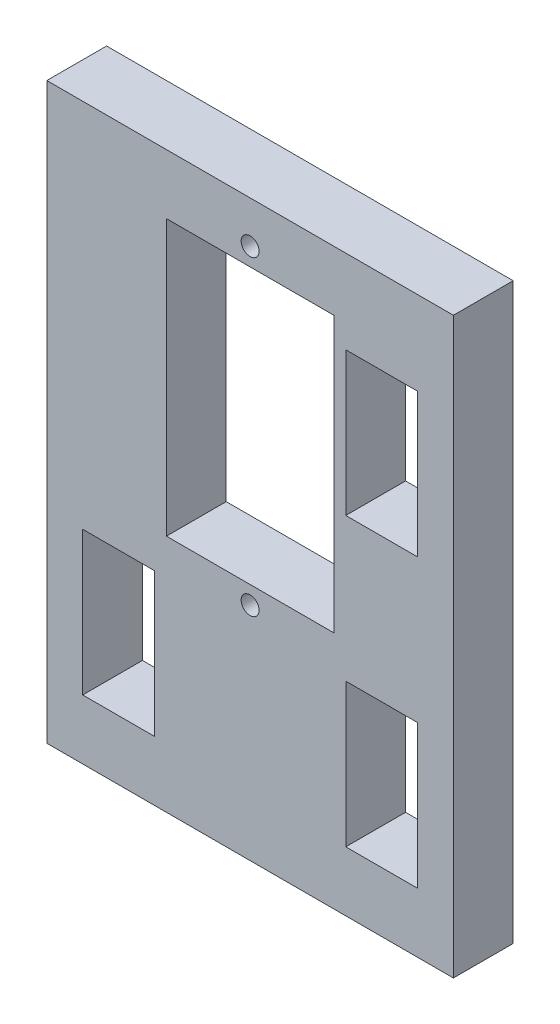
ISO-10303-21;
HEADER;
FILE_DESCRIPTION(('STEP AP214'),'2;1');
FILE_NAME('part.step','',(''),(''),'','','');
FILE_SCHEMA(('AUTOMOTIVE_DESIGN { 1 0 10303 214 1 1 1 1 }'));
ENDSEC;
DATA;
#1=APPLICATION_CONTEXT('core data for automotive mechanical design processes');
#2=APPLICATION_PROTOCOL_DEFINITION('international standard','automotive_design',2000,#1);
#3=PRODUCT_CONTEXT('',#1,'mechanical');
#4=PRODUCT('Part','Part','',(#3));
#5=PRODUCT_RELATED_PRODUCT_CATEGORY('part','',(#4));
#6=PRODUCT_DEFINITION_FORMATION('','',#4);
#7=PRODUCT_DEFINITION_CONTEXT('part definition',#1,'design');
#8=PRODUCT_DEFINITION('design','',#6,#7);
#9=PRODUCT_DEFINITION_SHAPE('','',#8);
#10=(LENGTH_UNIT() NAMED_UNIT(*) SI_UNIT(.MILLI.,.METRE.));
#11=(NAMED_UNIT(*) PLANE_ANGLE_UNIT() SI_UNIT($,.RADIAN.));
#12=(NAMED_UNIT(*) SI_UNIT($,.STERADIAN.) SOLID_ANGLE_UNIT());
#13=UNCERTAINTY_MEASURE_WITH_UNIT(LENGTH_MEASURE(1.E-05),#10,'distance_accuracy_value','');
#14=(GEOMETRIC_REPRESENTATION_CONTEXT(3) GLOBAL_UNCERTAINTY_ASSIGNED_CONTEXT((#13)) GLOBAL_UNIT_ASSIGNED_CONTEXT((#10,
#11,#12)) REPRESENTATION_CONTEXT('',''));
#15=CARTESIAN_POINT('',(0.,0.,0.));
#16=DIRECTION('',(0.,0.,1.));
#17=DIRECTION('',(1.,0.,0.));
#18=AXIS2_PLACEMENT_3D('',#15,#16,#17);
#19=CARTESIAN_POINT('',(0.,0.,5.));
#20=DIRECTION('',(0.,0.,-1.));
#21=DIRECTION('',(-1.,0.,0.));
#22=AXIS2_PLACEMENT_3D('',#19,#20,#21);
#23=PLANE('',#22);
#24=DIRECTION('',(0.,1.,0.));
#25=VECTOR('',#24,1.);
#26=CARTESIAN_POINT('',(31.,29.,5.));
#27=LINE('',#26,#25);
#28=CARTESIAN_POINT('',(31.,29.,5.));
#29=VERTEX_POINT('',#28);
#30=CARTESIAN_POINT('',(31.,41.,5.));
#31=VERTEX_POINT('',#30);
#32=EDGE_CURVE('E206',#29,#31,#27,.T.);
#33=ORIENTED_EDGE('',*,*,#32,.F.);
#34=DIRECTION('',(1.,0.,0.));
#35=VECTOR('',#34,1.);
#36=CARTESIAN_POINT('',(31.,29.,5.));
#37=LINE('',#36,#35);
#38=CARTESIAN_POINT('',(25.,29.,5.));
#39=VERTEX_POINT('',#38);
#40=EDGE_CURVE('E214',#39,#29,#37,.T.);
#41=ORIENTED_EDGE('',*,*,#40,.F.);
#42=DIRECTION('',(0.,-1.,0.));
#43=VECTOR('',#42,1.);
#44=CARTESIAN_POINT('',(25.,29.,5.));
#45=LINE('',#44,#43);
#46=CARTESIAN_POINT('',(25.,41.,5.));
#47=VERTEX_POINT('',#46);
#48=EDGE_CURVE('E211',#47,#39,#45,.T.);
#49=ORIENTED_EDGE('',*,*,#48,.F.);
#50=DIRECTION('',(-1.,0.,0.));
#51=VECTOR('',#50,1.);
#52=CARTESIAN_POINT('',(31.,41.,5.));
#53=LINE('',#52,#51);
#54=EDGE_CURVE('E208',#31,#47,#53,.T.);
#55=ORIENTED_EDGE('',*,*,#54,.F.);
#56=EDGE_LOOP('',(#33,#41,#49,#55));
#57=FACE_BOUND('',#56,.T.);
#58=CARTESIAN_POINT('',(17.,44.5,5.));
#59=DIRECTION('',(0.,0.,1.));
#60=DIRECTION('',(1.,0.,0.));
#61=AXIS2_PLACEMENT_3D('',#58,#59,#60);
#62=CIRCLE('',#61,0.750000000000002);
#63=CARTESIAN_POINT('',(17.75,44.5,5.));
#64=VERTEX_POINT('',#63);
#65=EDGE_CURVE('E268',#64,#64,#62,.T.);
#66=ORIENTED_EDGE('',*,*,#65,.F.);
#67=EDGE_LOOP('',(#66));
#68=FACE_BOUND('',#67,.T.);
#69=CARTESIAN_POINT('',(17.,18.5,5.));
#70=DIRECTION('',(0.,0.,1.));
#71=DIRECTION('',(1.,0.,0.));
#72=AXIS2_PLACEMENT_3D('',#69,#70,#71);
#73=CIRCLE('',#72,0.750000000000002);
#74=CARTESIAN_POINT('',(17.75,18.5,5.));
#75=VERTEX_POINT('',#74);
#76=EDGE_CURVE('E274',#75,#75,#73,.T.);
#77=ORIENTED_EDGE('',*,*,#76,.F.);
#78=EDGE_LOOP('',(#77));
#79=FACE_BOUND('',#78,.T.);
#80=DIRECTION('',(0.,-1.,0.));
#81=VECTOR('',#80,1.);
#82=CARTESIAN_POINT('',(10.,20.,5.));
#83=LINE('',#82,#81);
#84=CARTESIAN_POINT('',(10.,43.,5.));
#85=VERTEX_POINT('',#84);
#86=CARTESIAN_POINT('',(10.,20.,5.));
#87=VERTEX_POINT('',#86);
#88=EDGE_CURVE('E280',#85,#87,#83,.T.);
#89=ORIENTED_EDGE('',*,*,#88,.F.);
#90=DIRECTION('',(-1.,0.,0.));
#91=VECTOR('',#90,1.);
#92=CARTESIAN_POINT('',(24.,43.,5.));
#93=LINE('',#92,#91);
#94=CARTESIAN_POINT('',(24.,43.,5.));
#95=VERTEX_POINT('',#94);
#96=EDGE_CURVE('E288',#95,#85,#93,.T.);
#97=ORIENTED_EDGE('',*,*,#96,.F.);
#98=DIRECTION('',(0.,1.,0.));
#99=VECTOR('',#98,1.);
#100=CARTESIAN_POINT('',(24.,20.,5.));
#101=LINE('',#100,#99);
#102=CARTESIAN_POINT('',(24.,20.,5.));
#103=VERTEX_POINT('',#102);
#104=EDGE_CURVE('E285',#103,#95,#101,.T.);
#105=ORIENTED_EDGE('',*,*,#104,.F.);
#106=DIRECTION('',(1.,0.,0.));
#107=VECTOR('',#106,1.);
#108=CARTESIAN_POINT('',(24.,20.,5.));
#109=LINE('',#108,#107);
#110=EDGE_CURVE('E282',#87,#103,#109,.T.);
#111=ORIENTED_EDGE('',*,*,#110,.F.);
#112=EDGE_LOOP('',(#89,#97,#105,#111));
#113=FACE_BOUND('',#112,.T.);
#114=DIRECTION('',(0.,-1.,0.));
#115=VECTOR('',#114,1.);
#116=CARTESIAN_POINT('',(0.,0.,5.));
#117=LINE('',#116,#115);
#118=CARTESIAN_POINT('',(0.,48.,5.));
#119=VERTEX_POINT('',#118);
#120=CARTESIAN_POINT('',(0.,0.,5.));
#121=VERTEX_POINT('',#120);
#122=EDGE_CURVE('E311',#119,#121,#117,.T.);
#123=ORIENTED_EDGE('',*,*,#122,.T.);
#124=DIRECTION('',(1.,0.,0.));
#125=VECTOR('',#124,1.);
#126=CARTESIAN_POINT('',(0.,0.,5.));
#127=LINE('',#126,#125);
#128=CARTESIAN_POINT('',(34.,0.,5.));
#129=VERTEX_POINT('',#128);
#130=EDGE_CURVE('E314',#121,#129,#127,.T.);
#131=ORIENTED_EDGE('',*,*,#130,.T.);
#132=DIRECTION('',(0.,1.,0.));
#133=VECTOR('',#132,1.);
#134=CARTESIAN_POINT('',(34.,0.,5.));
#135=LINE('',#134,#133);
#136=CARTESIAN_POINT('',(33.9999999999999,48.,5.));
#137=VERTEX_POINT('',#136);
#138=EDGE_CURVE('E317',#129,#137,#135,.T.);
#139=ORIENTED_EDGE('',*,*,#138,.T.);
#140=DIRECTION('',(-1.,0.,0.));
#141=VECTOR('',#140,1.);
#142=CARTESIAN_POINT('',(0.,48.,5.));
#143=LINE('',#142,#141);
#144=EDGE_CURVE('E319',#137,#119,#143,.T.);
#145=ORIENTED_EDGE('',*,*,#144,.T.);
#146=EDGE_LOOP('',(#123,#131,#139,#145));
#147=FACE_BOUND('',#146,.T.);
#148=DIRECTION('',(0.,1.,0.));
#149=VECTOR('',#148,1.);
#150=CARTESIAN_POINT('',(31.,5.,5.));
#151=LINE('',#150,#149);
#152=CARTESIAN_POINT('',(31.,5.,5.));
#153=VERTEX_POINT('',#152);
#154=CARTESIAN_POINT('',(31.,17.,5.));
#155=VERTEX_POINT('',#154);
#156=EDGE_CURVE('E237',#153,#155,#151,.T.);
#157=ORIENTED_EDGE('',*,*,#156,.F.);
#158=DIRECTION('',(1.,0.,0.));
#159=VECTOR('',#158,1.);
#160=CARTESIAN_POINT('',(31.,5.,5.));
#161=LINE('',#160,#159);
#162=CARTESIAN_POINT('',(25.,5.,5.));
#163=VERTEX_POINT('',#162);
#164=EDGE_CURVE('E245',#163,#153,#161,.T.);
#165=ORIENTED_EDGE('',*,*,#164,.F.);
#166=DIRECTION('',(0.,-1.,0.));
#167=VECTOR('',#166,1.);
#168=CARTESIAN_POINT('',(25.,5.,5.));
#169=LINE('',#168,#167);
#170=CARTESIAN_POINT('',(25.,17.,5.));
#171=VERTEX_POINT('',#170);
#172=EDGE_CURVE('E242',#171,#163,#169,.T.);
#173=ORIENTED_EDGE('',*,*,#172,.F.);
#174=DIRECTION('',(-1.,0.,0.));
#175=VECTOR('',#174,1.);
#176=CARTESIAN_POINT('',(31.,17.,5.));
#177=LINE('',#176,#175);
#178=EDGE_CURVE('E239',#155,#171,#177,.T.);
#179=ORIENTED_EDGE('',*,*,#178,.F.);
#180=EDGE_LOOP('',(#157,#165,#173,#179));
#181=FACE_BOUND('',#180,.T.);
#182=DIRECTION('',(0.,1.,0.));
#183=VECTOR('',#182,1.);
#184=CARTESIAN_POINT('',(9.00000000000001,5.,5.));
#185=LINE('',#184,#183);
#186=CARTESIAN_POINT('',(9.00000000000001,5.,5.));
#187=VERTEX_POINT('',#186);
#188=CARTESIAN_POINT('',(8.99999999999993,17.,5.));
#189=VERTEX_POINT('',#188);
#190=EDGE_CURVE('E170',#187,#189,#185,.T.);
#191=ORIENTED_EDGE('',*,*,#190,.F.);
#192=DIRECTION('',(1.,0.,0.));
#193=VECTOR('',#192,1.);
#194=CARTESIAN_POINT('',(9.00000000000001,5.,5.));
#195=LINE('',#194,#193);
#196=CARTESIAN_POINT('',(3.00000000000001,5.,5.));
#197=VERTEX_POINT('',#196);
#198=EDGE_CURVE('E192',#197,#187,#195,.T.);
#199=ORIENTED_EDGE('',*,*,#198,.F.);
#200=DIRECTION('',(0.,-1.,0.));
#201=VECTOR('',#200,1.);
#202=CARTESIAN_POINT('',(3.00000000000001,5.,5.));
#203=LINE('',#202,#201);
#204=CARTESIAN_POINT('',(2.99999999999994,17.,5.));
#205=VERTEX_POINT('',#204);
#206=EDGE_CURVE('E190',#205,#197,#203,.T.);
#207=ORIENTED_EDGE('',*,*,#206,.F.);
#208=DIRECTION('',(-1.,0.,0.));
#209=VECTOR('',#208,1.);
#210=CARTESIAN_POINT('',(8.99999999999993,17.,5.));
#211=LINE('',#210,#209);
#212=EDGE_CURVE('E178',#189,#205,#211,.T.);
#213=ORIENTED_EDGE('',*,*,#212,.F.);
#214=EDGE_LOOP('',(#191,#199,#207,#213));
#215=FACE_BOUND('',#214,.T.);
#216=ADVANCED_FACE('F33',(#57,#68,#79,#113,#147,#181,#215),#23,.F.);
#217=CARTESIAN_POINT('',(0.,0.,0.));
#218=DIRECTION('',(0.,0.,-1.));
#219=DIRECTION('',(-1.,0.,0.));
#220=AXIS2_PLACEMENT_3D('',#217,#218,#219);
#221=PLANE('',#220);
#222=CARTESIAN_POINT('',(17.,18.5,0.));
#223=DIRECTION('',(0.,0.,1.));
#224=DIRECTION('',(1.,0.,0.));
#225=AXIS2_PLACEMENT_3D('',#222,#223,#224);
#226=CIRCLE('',#225,0.750000000000002);
#227=CARTESIAN_POINT('',(17.75,18.5,0.));
#228=VERTEX_POINT('',#227);
#229=EDGE_CURVE('E271',#228,#228,#226,.T.);
#230=ORIENTED_EDGE('',*,*,#229,.T.);
#231=EDGE_LOOP('',(#230));
#232=FACE_BOUND('',#231,.T.);
#233=DIRECTION('',(0.,-1.,0.));
#234=VECTOR('',#233,1.);
#235=CARTESIAN_POINT('',(0.,0.,0.));
#236=LINE('',#235,#234);
#237=CARTESIAN_POINT('',(0.,48.,0.));
#238=VERTEX_POINT('',#237);
#239=CARTESIAN_POINT('',(0.,0.,0.));
#240=VERTEX_POINT('',#239);
#241=EDGE_CURVE('E310',#238,#240,#236,.T.);
#242=ORIENTED_EDGE('',*,*,#241,.F.);
#243=DIRECTION('',(-1.,0.,0.));
#244=VECTOR('',#243,1.);
#245=CARTESIAN_POINT('',(0.,48.,0.));
#246=LINE('',#245,#244);
#247=CARTESIAN_POINT('',(33.9999999999999,48.,0.));
#248=VERTEX_POINT('',#247);
#249=EDGE_CURVE('E315',#248,#238,#246,.T.);
#250=ORIENTED_EDGE('',*,*,#249,.F.);
#251=DIRECTION('',(0.,1.,0.));
#252=VECTOR('',#251,1.);
#253=CARTESIAN_POINT('',(34.,0.,0.));
#254=LINE('',#253,#252);
#255=CARTESIAN_POINT('',(34.,0.,0.));
#256=VERTEX_POINT('',#255);
#257=EDGE_CURVE('E326',#256,#248,#254,.T.);
#258=ORIENTED_EDGE('',*,*,#257,.F.);
#259=DIRECTION('',(1.,0.,0.));
#260=VECTOR('',#259,1.);
#261=CARTESIAN_POINT('',(0.,0.,0.));
#262=LINE('',#261,#260);
#263=EDGE_CURVE('E324',#240,#256,#262,.T.);
#264=ORIENTED_EDGE('',*,*,#263,.F.);
#265=EDGE_LOOP('',(#242,#250,#258,#264));
#266=FACE_BOUND('',#265,.T.);
#267=DIRECTION('',(-1.,0.,0.));
#268=VECTOR('',#267,1.);
#269=CARTESIAN_POINT('',(24.,43.,0.));
#270=LINE('',#269,#268);
#271=CARTESIAN_POINT('',(24.,43.,0.));
#272=VERTEX_POINT('',#271);
#273=CARTESIAN_POINT('',(10.,43.,0.));
#274=VERTEX_POINT('',#273);
#275=EDGE_CURVE('E283',#272,#274,#270,.T.);
#276=ORIENTED_EDGE('',*,*,#275,.T.);
#277=DIRECTION('',(0.,-1.,0.));
#278=VECTOR('',#277,1.);
#279=CARTESIAN_POINT('',(10.,20.,0.));
#280=LINE('',#279,#278);
#281=CARTESIAN_POINT('',(10.,20.,0.));
#282=VERTEX_POINT('',#281);
#283=EDGE_CURVE('E277',#274,#282,#280,.T.);
#284=ORIENTED_EDGE('',*,*,#283,.T.);
#285=DIRECTION('',(1.,0.,0.));
#286=VECTOR('',#285,1.);
#287=CARTESIAN_POINT('',(24.,20.,0.));
#288=LINE('',#287,#286);
#289=CARTESIAN_POINT('',(24.,20.,0.));
#290=VERTEX_POINT('',#289);
#291=EDGE_CURVE('E293',#282,#290,#288,.T.);
#292=ORIENTED_EDGE('',*,*,#291,.T.);
#293=DIRECTION('',(0.,1.,0.));
#294=VECTOR('',#293,1.);
#295=CARTESIAN_POINT('',(24.,20.,0.));
#296=LINE('',#295,#294);
#297=EDGE_CURVE('E296',#290,#272,#296,.T.);
#298=ORIENTED_EDGE('',*,*,#297,.T.);
#299=EDGE_LOOP('',(#276,#284,#292,#298));
#300=FACE_BOUND('',#299,.T.);
#301=CARTESIAN_POINT('',(17.,44.5,0.));
#302=DIRECTION('',(0.,0.,1.));
#303=DIRECTION('',(1.,0.,0.));
#304=AXIS2_PLACEMENT_3D('',#301,#302,#303);
#305=CIRCLE('',#304,0.750000000000002);
#306=CARTESIAN_POINT('',(17.75,44.5,0.));
#307=VERTEX_POINT('',#306);
#308=EDGE_CURVE('E267',#307,#307,#305,.T.);
#309=ORIENTED_EDGE('',*,*,#308,.T.);
#310=EDGE_LOOP('',(#309));
#311=FACE_BOUND('',#310,.T.);
#312=DIRECTION('',(1.,0.,0.));
#313=VECTOR('',#312,1.);
#314=CARTESIAN_POINT('',(31.,5.,0.));
#315=LINE('',#314,#313);
#316=CARTESIAN_POINT('',(25.,5.,0.));
#317=VERTEX_POINT('',#316);
#318=CARTESIAN_POINT('',(31.,5.,0.));
#319=VERTEX_POINT('',#318);
#320=EDGE_CURVE('E240',#317,#319,#315,.T.);
#321=ORIENTED_EDGE('',*,*,#320,.T.);
#322=DIRECTION('',(0.,1.,0.));
#323=VECTOR('',#322,1.);
#324=CARTESIAN_POINT('',(31.,5.,0.));
#325=LINE('',#324,#323);
#326=CARTESIAN_POINT('',(31.,17.,0.));
#327=VERTEX_POINT('',#326);
#328=EDGE_CURVE('E236',#319,#327,#325,.T.);
#329=ORIENTED_EDGE('',*,*,#328,.T.);
#330=DIRECTION('',(-1.,0.,0.));
#331=VECTOR('',#330,1.);
#332=CARTESIAN_POINT('',(31.,17.,0.));
#333=LINE('',#332,#331);
#334=CARTESIAN_POINT('',(25.,17.,0.));
#335=VERTEX_POINT('',#334);
#336=EDGE_CURVE('E250',#327,#335,#333,.T.);
#337=ORIENTED_EDGE('',*,*,#336,.T.);
#338=DIRECTION('',(0.,-1.,0.));
#339=VECTOR('',#338,1.);
#340=CARTESIAN_POINT('',(25.,5.,0.));
#341=LINE('',#340,#339);
#342=EDGE_CURVE('E253',#335,#317,#341,.T.);
#343=ORIENTED_EDGE('',*,*,#342,.T.);
#344=EDGE_LOOP('',(#321,#329,#337,#343));
#345=FACE_BOUND('',#344,.T.);
#346=DIRECTION('',(1.,0.,0.));
#347=VECTOR('',#346,1.);
#348=CARTESIAN_POINT('',(31.,29.,0.));
#349=LINE('',#348,#347);
#350=CARTESIAN_POINT('',(25.,29.,0.));
#351=VERTEX_POINT('',#350);
#352=CARTESIAN_POINT('',(31.,29.,0.));
#353=VERTEX_POINT('',#352);
#354=EDGE_CURVE('E209',#351,#353,#349,.T.);
#355=ORIENTED_EDGE('',*,*,#354,.T.);
#356=DIRECTION('',(0.,1.,0.));
#357=VECTOR('',#356,1.);
#358=CARTESIAN_POINT('',(31.,29.,0.));
#359=LINE('',#358,#357);
#360=CARTESIAN_POINT('',(31.,41.,0.));
#361=VERTEX_POINT('',#360);
#362=EDGE_CURVE('E186',#353,#361,#359,.T.);
#363=ORIENTED_EDGE('',*,*,#362,.T.);
#364=DIRECTION('',(-1.,0.,0.));
#365=VECTOR('',#364,1.);
#366=CARTESIAN_POINT('',(31.,41.,0.));
#367=LINE('',#366,#365);
#368=CARTESIAN_POINT('',(25.,41.,0.));
#369=VERTEX_POINT('',#368);
#370=EDGE_CURVE('E219',#361,#369,#367,.T.);
#371=ORIENTED_EDGE('',*,*,#370,.T.);
#372=DIRECTION('',(0.,-1.,0.));
#373=VECTOR('',#372,1.);
#374=CARTESIAN_POINT('',(25.,29.,0.));
#375=LINE('',#374,#373);
#376=EDGE_CURVE('E222',#369,#351,#375,.T.);
#377=ORIENTED_EDGE('',*,*,#376,.T.);
#378=EDGE_LOOP('',(#355,#363,#371,#377));
#379=FACE_BOUND('',#378,.T.);
#380=DIRECTION('',(1.,0.,0.));
#381=VECTOR('',#380,1.);
#382=CARTESIAN_POINT('',(9.00000000000001,5.,0.));
#383=LINE('',#382,#381);
#384=CARTESIAN_POINT('',(3.00000000000001,5.,0.));
#385=VERTEX_POINT('',#384);
#386=CARTESIAN_POINT('',(9.00000000000001,5.,0.));
#387=VERTEX_POINT('',#386);
#388=EDGE_CURVE('E179',#385,#387,#383,.T.);
#389=ORIENTED_EDGE('',*,*,#388,.T.);
#390=DIRECTION('',(0.,1.,0.));
#391=VECTOR('',#390,1.);
#392=CARTESIAN_POINT('',(9.00000000000001,5.,0.));
#393=LINE('',#392,#391);
#394=CARTESIAN_POINT('',(8.99999999999993,17.,0.));
#395=VERTEX_POINT('',#394);
#396=EDGE_CURVE('E56',#387,#395,#393,.T.);
#397=ORIENTED_EDGE('',*,*,#396,.T.);
#398=DIRECTION('',(-1.,0.,0.));
#399=VECTOR('',#398,1.);
#400=CARTESIAN_POINT('',(8.99999999999993,17.,0.));
#401=LINE('',#400,#399);
#402=CARTESIAN_POINT('',(2.99999999999994,17.,0.));
#403=VERTEX_POINT('',#402);
#404=EDGE_CURVE('E185',#395,#403,#401,.T.);
#405=ORIENTED_EDGE('',*,*,#404,.T.);
#406=DIRECTION('',(0.,-1.,0.));
#407=VECTOR('',#406,1.);
#408=CARTESIAN_POINT('',(3.00000000000001,5.,0.));
#409=LINE('',#408,#407);
#410=EDGE_CURVE('E198',#403,#385,#409,.T.);
#411=ORIENTED_EDGE('',*,*,#410,.T.);
#412=EDGE_LOOP('',(#389,#397,#405,#411));
#413=FACE_BOUND('',#412,.T.);
#414=ADVANCED_FACE('F344',(#232,#266,#300,#311,#345,#379,#413),#221,.T.);
#415=CARTESIAN_POINT('',(0.,0.,5.));
#416=DIRECTION('',(1.,0.,0.));
#417=DIRECTION('',(0.,0.,-1.));
#418=AXIS2_PLACEMENT_3D('',#415,#416,#417);
#419=PLANE('',#418);
#420=ORIENTED_EDGE('',*,*,#241,.T.);
#421=DIRECTION('',(0.,0.,-1.));
#422=VECTOR('',#421,1.);
#423=CARTESIAN_POINT('',(0.,0.,5.));
#424=LINE('',#423,#422);
#425=EDGE_CURVE('E11',#121,#240,#424,.T.);
#426=ORIENTED_EDGE('',*,*,#425,.F.);
#427=ORIENTED_EDGE('',*,*,#122,.F.);
#428=DIRECTION('',(0.,0.,-1.));
#429=VECTOR('',#428,1.);
#430=CARTESIAN_POINT('',(0.,48.,5.));
#431=LINE('',#430,#429);
#432=EDGE_CURVE('E321',#119,#238,#431,.T.);
#433=ORIENTED_EDGE('',*,*,#432,.T.);
#434=EDGE_LOOP('',(#420,#426,#427,#433));
#435=FACE_BOUND('',#434,.T.);
#436=ADVANCED_FACE('F35',(#435),#419,.F.);
#437=CARTESIAN_POINT('',(0.,0.,5.));
#438=DIRECTION('',(0.,1.,0.));
#439=DIRECTION('',(0.,0.,1.));
#440=AXIS2_PLACEMENT_3D('',#437,#438,#439);
#441=PLANE('',#440);
#442=ORIENTED_EDGE('',*,*,#263,.T.);
#443=DIRECTION('',(0.,0.,-1.));
#444=VECTOR('',#443,1.);
#445=CARTESIAN_POINT('',(34.,0.,5.));
#446=LINE('',#445,#444);
#447=EDGE_CURVE('E41',#129,#256,#446,.T.);
#448=ORIENTED_EDGE('',*,*,#447,.F.);
#449=ORIENTED_EDGE('',*,*,#130,.F.);
#450=ORIENTED_EDGE('',*,*,#425,.T.);
#451=EDGE_LOOP('',(#442,#448,#449,#450));
#452=FACE_BOUND('',#451,.T.);
#453=ADVANCED_FACE('F355',(#452),#441,.F.);
#454=CARTESIAN_POINT('',(34.,0.,5.));
#455=DIRECTION('',(-1.,0.,0.));
#456=DIRECTION('',(0.,-1.,0.));
#457=AXIS2_PLACEMENT_3D('',#454,#455,#456);
#458=PLANE('',#457);
#459=ORIENTED_EDGE('',*,*,#257,.T.);
#460=DIRECTION('',(0.,0.,-1.));
#461=VECTOR('',#460,1.);
#462=CARTESIAN_POINT('',(33.9999999999999,48.,5.));
#463=LINE('',#462,#461);
#464=EDGE_CURVE('E331',#137,#248,#463,.T.);
#465=ORIENTED_EDGE('',*,*,#464,.F.);
#466=ORIENTED_EDGE('',*,*,#138,.F.);
#467=ORIENTED_EDGE('',*,*,#447,.T.);
#468=EDGE_LOOP('',(#459,#465,#466,#467));
#469=FACE_BOUND('',#468,.T.);
#470=ADVANCED_FACE('F338',(#469),#458,.F.);
#471=CARTESIAN_POINT('',(0.,48.,5.));
#472=DIRECTION('',(0.,-1.,0.));
#473=DIRECTION('',(1.,0.,0.));
#474=AXIS2_PLACEMENT_3D('',#471,#472,#473);
#475=PLANE('',#474);
#476=ORIENTED_EDGE('',*,*,#249,.T.);
#477=ORIENTED_EDGE('',*,*,#432,.F.);
#478=ORIENTED_EDGE('',*,*,#144,.F.);
#479=ORIENTED_EDGE('',*,*,#464,.T.);
#480=EDGE_LOOP('',(#476,#477,#478,#479));
#481=FACE_BOUND('',#480,.T.);
#482=ADVANCED_FACE('F348',(#481),#475,.F.);
#483=CARTESIAN_POINT('',(10.,20.,5.));
#484=DIRECTION('',(1.,0.,0.));
#485=DIRECTION('',(0.,1.,0.));
#486=AXIS2_PLACEMENT_3D('',#483,#484,#485);
#487=PLANE('',#486);
#488=ORIENTED_EDGE('',*,*,#283,.F.);
#489=DIRECTION('',(0.,0.,-1.));
#490=VECTOR('',#489,1.);
#491=CARTESIAN_POINT('',(10.,43.,5.));
#492=LINE('',#491,#490);
#493=EDGE_CURVE('E290',#85,#274,#492,.T.);
#494=ORIENTED_EDGE('',*,*,#493,.F.);
#495=ORIENTED_EDGE('',*,*,#88,.T.);
#496=DIRECTION('',(0.,0.,-1.));
#497=VECTOR('',#496,1.);
#498=CARTESIAN_POINT('',(10.,20.,5.));
#499=LINE('',#498,#497);
#500=EDGE_CURVE('E307',#87,#282,#499,.T.);
#501=ORIENTED_EDGE('',*,*,#500,.T.);
#502=EDGE_LOOP('',(#488,#494,#495,#501));
#503=FACE_BOUND('',#502,.T.);
#504=ADVANCED_FACE('F373',(#503),#487,.T.);
#505=CARTESIAN_POINT('',(24.,20.,5.));
#506=DIRECTION('',(0.,1.,0.));
#507=DIRECTION('',(0.,0.,1.));
#508=AXIS2_PLACEMENT_3D('',#505,#506,#507);
#509=PLANE('',#508);
#510=ORIENTED_EDGE('',*,*,#291,.F.);
#511=ORIENTED_EDGE('',*,*,#500,.F.);
#512=ORIENTED_EDGE('',*,*,#110,.T.);
#513=DIRECTION('',(0.,0.,-1.));
#514=VECTOR('',#513,1.);
#515=CARTESIAN_POINT('',(24.,20.,5.));
#516=LINE('',#515,#514);
#517=EDGE_CURVE('E305',#103,#290,#516,.T.);
#518=ORIENTED_EDGE('',*,*,#517,.T.);
#519=EDGE_LOOP('',(#510,#511,#512,#518));
#520=FACE_BOUND('',#519,.T.);
#521=ADVANCED_FACE('F380',(#520),#509,.T.);
#522=CARTESIAN_POINT('',(24.,20.,5.));
#523=DIRECTION('',(-1.,0.,0.));
#524=DIRECTION('',(0.,-1.,0.));
#525=AXIS2_PLACEMENT_3D('',#522,#523,#524);
#526=PLANE('',#525);
#527=ORIENTED_EDGE('',*,*,#297,.F.);
#528=ORIENTED_EDGE('',*,*,#517,.F.);
#529=ORIENTED_EDGE('',*,*,#104,.T.);
#530=DIRECTION('',(0.,0.,-1.));
#531=VECTOR('',#530,1.);
#532=CARTESIAN_POINT('',(24.,43.,5.));
#533=LINE('',#532,#531);
#534=EDGE_CURVE('E303',#95,#272,#533,.T.);
#535=ORIENTED_EDGE('',*,*,#534,.T.);
#536=EDGE_LOOP('',(#527,#528,#529,#535));
#537=FACE_BOUND('',#536,.T.);
#538=ADVANCED_FACE('F385',(#537),#526,.T.);
#539=CARTESIAN_POINT('',(24.,43.,5.));
#540=DIRECTION('',(0.,-1.,0.));
#541=DIRECTION('',(0.,0.,-1.));
#542=AXIS2_PLACEMENT_3D('',#539,#540,#541);
#543=PLANE('',#542);
#544=ORIENTED_EDGE('',*,*,#275,.F.);
#545=ORIENTED_EDGE('',*,*,#534,.F.);
#546=ORIENTED_EDGE('',*,*,#96,.T.);
#547=ORIENTED_EDGE('',*,*,#493,.T.);
#548=EDGE_LOOP('',(#544,#545,#546,#547));
#549=FACE_BOUND('',#548,.T.);
#550=ADVANCED_FACE('F392',(#549),#543,.T.);
#551=CARTESIAN_POINT('',(17.,18.5,5.));
#552=DIRECTION('',(0.,0.,-1.));
#553=DIRECTION('',(-1.,0.,0.));
#554=AXIS2_PLACEMENT_3D('',#551,#552,#553);
#555=CYLINDRICAL_SURFACE('',#554,0.750000000000002);
#556=ORIENTED_EDGE('',*,*,#76,.T.);
#557=EDGE_LOOP('',(#556));
#558=FACE_BOUND('',#557,.T.);
#559=ORIENTED_EDGE('',*,*,#229,.F.);
#560=EDGE_LOOP('',(#559));
#561=FACE_BOUND('',#560,.T.);
#562=ADVANCED_FACE('F406',(#558,#561),#555,.F.);
#563=CARTESIAN_POINT('',(17.,44.5,5.));
#564=DIRECTION('',(0.,0.,-1.));
#565=DIRECTION('',(-1.,0.,0.));
#566=AXIS2_PLACEMENT_3D('',#563,#564,#565);
#567=CYLINDRICAL_SURFACE('',#566,0.750000000000002);
#568=ORIENTED_EDGE('',*,*,#65,.T.);
#569=EDGE_LOOP('',(#568));
#570=FACE_BOUND('',#569,.T.);
#571=ORIENTED_EDGE('',*,*,#308,.F.);
#572=EDGE_LOOP('',(#571));
#573=FACE_BOUND('',#572,.T.);
#574=ADVANCED_FACE('F411',(#570,#573),#567,.F.);
#575=CARTESIAN_POINT('',(31.,5.,5.));
#576=DIRECTION('',(-1.,0.,0.));
#577=DIRECTION('',(0.,0.,1.));
#578=AXIS2_PLACEMENT_3D('',#575,#576,#577);
#579=PLANE('',#578);
#580=ORIENTED_EDGE('',*,*,#328,.F.);
#581=DIRECTION('',(0.,0.,-1.));
#582=VECTOR('',#581,1.);
#583=CARTESIAN_POINT('',(31.,5.,5.));
#584=LINE('',#583,#582);
#585=EDGE_CURVE('E247',#153,#319,#584,.T.);
#586=ORIENTED_EDGE('',*,*,#585,.F.);
#587=ORIENTED_EDGE('',*,*,#156,.T.);
#588=DIRECTION('',(0.,0.,-1.));
#589=VECTOR('',#588,1.);
#590=CARTESIAN_POINT('',(31.,17.,5.));
#591=LINE('',#590,#589);
#592=EDGE_CURVE('E264',#155,#327,#591,.T.);
#593=ORIENTED_EDGE('',*,*,#592,.T.);
#594=EDGE_LOOP('',(#580,#586,#587,#593));
#595=FACE_BOUND('',#594,.T.);
#596=ADVANCED_FACE('F415',(#595),#579,.T.);
#597=CARTESIAN_POINT('',(31.,17.,5.));
#598=DIRECTION('',(0.,-1.,0.));
#599=DIRECTION('',(0.,0.,-1.));
#600=AXIS2_PLACEMENT_3D('',#597,#598,#599);
#601=PLANE('',#600);
#602=ORIENTED_EDGE('',*,*,#336,.F.);
#603=ORIENTED_EDGE('',*,*,#592,.F.);
#604=ORIENTED_EDGE('',*,*,#178,.T.);
#605=DIRECTION('',(0.,0.,-1.));
#606=VECTOR('',#605,1.);
#607=CARTESIAN_POINT('',(25.,17.,5.));
#608=LINE('',#607,#606);
#609=EDGE_CURVE('E262',#171,#335,#608,.T.);
#610=ORIENTED_EDGE('',*,*,#609,.T.);
#611=EDGE_LOOP('',(#602,#603,#604,#610));
#612=FACE_BOUND('',#611,.T.);
#613=ADVANCED_FACE('F419',(#612),#601,.T.);
#614=CARTESIAN_POINT('',(25.,5.,5.));
#615=DIRECTION('',(1.,0.,0.));
#616=DIRECTION('',(0.,0.,-1.));
#617=AXIS2_PLACEMENT_3D('',#614,#615,#616);
#618=PLANE('',#617);
#619=ORIENTED_EDGE('',*,*,#342,.F.);
#620=ORIENTED_EDGE('',*,*,#609,.F.);
#621=ORIENTED_EDGE('',*,*,#172,.T.);
#622=DIRECTION('',(0.,0.,-1.));
#623=VECTOR('',#622,1.);
#624=CARTESIAN_POINT('',(25.,5.,5.));
#625=LINE('',#624,#623);
#626=EDGE_CURVE('E260',#163,#317,#625,.T.);
#627=ORIENTED_EDGE('',*,*,#626,.T.);
#628=EDGE_LOOP('',(#619,#620,#621,#627));
#629=FACE_BOUND('',#628,.T.);
#630=ADVANCED_FACE('F423',(#629),#618,.T.);
#631=CARTESIAN_POINT('',(31.,5.,5.));
#632=DIRECTION('',(0.,1.,0.));
#633=DIRECTION('',(-1.,0.,0.));
#634=AXIS2_PLACEMENT_3D('',#631,#632,#633);
#635=PLANE('',#634);
#636=ORIENTED_EDGE('',*,*,#320,.F.);
#637=ORIENTED_EDGE('',*,*,#626,.F.);
#638=ORIENTED_EDGE('',*,*,#164,.T.);
#639=ORIENTED_EDGE('',*,*,#585,.T.);
#640=EDGE_LOOP('',(#636,#637,#638,#639));
#641=FACE_BOUND('',#640,.T.);
#642=ADVANCED_FACE('F427',(#641),#635,.T.);
#643=CARTESIAN_POINT('',(31.,29.,5.));
#644=DIRECTION('',(-1.,0.,0.));
#645=DIRECTION('',(0.,0.,1.));
#646=AXIS2_PLACEMENT_3D('',#643,#644,#645);
#647=PLANE('',#646);
#648=ORIENTED_EDGE('',*,*,#362,.F.);
#649=DIRECTION('',(0.,0.,-1.));
#650=VECTOR('',#649,1.);
#651=CARTESIAN_POINT('',(31.,29.,5.));
#652=LINE('',#651,#650);
#653=EDGE_CURVE('E216',#29,#353,#652,.T.);
#654=ORIENTED_EDGE('',*,*,#653,.F.);
#655=ORIENTED_EDGE('',*,*,#32,.T.);
#656=DIRECTION('',(0.,0.,-1.));
#657=VECTOR('',#656,1.);
#658=CARTESIAN_POINT('',(31.,41.,5.));
#659=LINE('',#658,#657);
#660=EDGE_CURVE('E233',#31,#361,#659,.T.);
#661=ORIENTED_EDGE('',*,*,#660,.T.);
#662=EDGE_LOOP('',(#648,#654,#655,#661));
#663=FACE_BOUND('',#662,.T.);
#664=ADVANCED_FACE('F431',(#663),#647,.T.);
#665=CARTESIAN_POINT('',(31.,41.,5.));
#666=DIRECTION('',(0.,-1.,0.));
#667=DIRECTION('',(0.,0.,-1.));
#668=AXIS2_PLACEMENT_3D('',#665,#666,#667);
#669=PLANE('',#668);
#670=ORIENTED_EDGE('',*,*,#370,.F.);
#671=ORIENTED_EDGE('',*,*,#660,.F.);
#672=ORIENTED_EDGE('',*,*,#54,.T.);
#673=DIRECTION('',(0.,0.,-1.));
#674=VECTOR('',#673,1.);
#675=CARTESIAN_POINT('',(25.,41.,5.));
#676=LINE('',#675,#674);
#677=EDGE_CURVE('E231',#47,#369,#676,.T.);
#678=ORIENTED_EDGE('',*,*,#677,.T.);
#679=EDGE_LOOP('',(#670,#671,#672,#678));
#680=FACE_BOUND('',#679,.T.);
#681=ADVANCED_FACE('F435',(#680),#669,.T.);
#682=CARTESIAN_POINT('',(25.,29.,5.));
#683=DIRECTION('',(1.,0.,0.));
#684=DIRECTION('',(0.,0.,-1.));
#685=AXIS2_PLACEMENT_3D('',#682,#683,#684);
#686=PLANE('',#685);
#687=ORIENTED_EDGE('',*,*,#376,.F.);
#688=ORIENTED_EDGE('',*,*,#677,.F.);
#689=ORIENTED_EDGE('',*,*,#48,.T.);
#690=DIRECTION('',(0.,0.,-1.));
#691=VECTOR('',#690,1.);
#692=CARTESIAN_POINT('',(25.,29.,5.));
#693=LINE('',#692,#691);
#694=EDGE_CURVE('E229',#39,#351,#693,.T.);
#695=ORIENTED_EDGE('',*,*,#694,.T.);
#696=EDGE_LOOP('',(#687,#688,#689,#695));
#697=FACE_BOUND('',#696,.T.);
#698=ADVANCED_FACE('F439',(#697),#686,.T.);
#699=CARTESIAN_POINT('',(31.,29.,5.));
#700=DIRECTION('',(0.,1.,0.));
#701=DIRECTION('',(0.,0.,1.));
#702=AXIS2_PLACEMENT_3D('',#699,#700,#701);
#703=PLANE('',#702);
#704=ORIENTED_EDGE('',*,*,#354,.F.);
#705=ORIENTED_EDGE('',*,*,#694,.F.);
#706=ORIENTED_EDGE('',*,*,#40,.T.);
#707=ORIENTED_EDGE('',*,*,#653,.T.);
#708=EDGE_LOOP('',(#704,#705,#706,#707));
#709=FACE_BOUND('',#708,.T.);
#710=ADVANCED_FACE('F443',(#709),#703,.T.);
#711=CARTESIAN_POINT('',(9.00000000000001,5.,5.));
#712=DIRECTION('',(-1.,0.,0.));
#713=DIRECTION('',(0.,-1.,0.));
#714=AXIS2_PLACEMENT_3D('',#711,#712,#713);
#715=PLANE('',#714);
#716=ORIENTED_EDGE('',*,*,#396,.F.);
#717=DIRECTION('',(0.,0.,-1.));
#718=VECTOR('',#717,1.);
#719=CARTESIAN_POINT('',(9.00000000000001,5.,5.));
#720=LINE('',#719,#718);
#721=EDGE_CURVE('E174',#187,#387,#720,.T.);
#722=ORIENTED_EDGE('',*,*,#721,.F.);
#723=ORIENTED_EDGE('',*,*,#190,.T.);
#724=DIRECTION('',(0.,0.,-1.));
#725=VECTOR('',#724,1.);
#726=CARTESIAN_POINT('',(8.99999999999993,17.,5.));
#727=LINE('',#726,#725);
#728=EDGE_CURVE('E173',#189,#395,#727,.T.);
#729=ORIENTED_EDGE('',*,*,#728,.T.);
#730=EDGE_LOOP('',(#716,#722,#723,#729));
#731=FACE_BOUND('',#730,.T.);
#732=ADVANCED_FACE('F172',(#731),#715,.T.);
#733=CARTESIAN_POINT('',(8.99999999999993,17.,5.));
#734=DIRECTION('',(0.,-1.,0.));
#735=DIRECTION('',(1.,0.,0.));
#736=AXIS2_PLACEMENT_3D('',#733,#734,#735);
#737=PLANE('',#736);
#738=ORIENTED_EDGE('',*,*,#404,.F.);
#739=ORIENTED_EDGE('',*,*,#728,.F.);
#740=ORIENTED_EDGE('',*,*,#212,.T.);
#741=DIRECTION('',(0.,0.,-1.));
#742=VECTOR('',#741,1.);
#743=CARTESIAN_POINT('',(2.99999999999994,17.,5.));
#744=LINE('',#743,#742);
#745=EDGE_CURVE('E187',#205,#403,#744,.T.);
#746=ORIENTED_EDGE('',*,*,#745,.T.);
#747=EDGE_LOOP('',(#738,#739,#740,#746));
#748=FACE_BOUND('',#747,.T.);
#749=ADVANCED_FACE('F182',(#748),#737,.T.);
#750=CARTESIAN_POINT('',(3.00000000000001,5.,5.));
#751=DIRECTION('',(1.,0.,0.));
#752=DIRECTION('',(0.,1.,0.));
#753=AXIS2_PLACEMENT_3D('',#750,#751,#752);
#754=PLANE('',#753);
#755=ORIENTED_EDGE('',*,*,#410,.F.);
#756=ORIENTED_EDGE('',*,*,#745,.F.);
#757=ORIENTED_EDGE('',*,*,#206,.T.);
#758=DIRECTION('',(0.,0.,-1.));
#759=VECTOR('',#758,1.);
#760=CARTESIAN_POINT('',(3.00000000000001,5.,5.));
#761=LINE('',#760,#759);
#762=EDGE_CURVE('E48',#197,#385,#761,.T.);
#763=ORIENTED_EDGE('',*,*,#762,.T.);
#764=EDGE_LOOP('',(#755,#756,#757,#763));
#765=FACE_BOUND('',#764,.T.);
#766=ADVANCED_FACE('F452',(#765),#754,.T.);
#767=CARTESIAN_POINT('',(9.00000000000001,5.,5.));
#768=DIRECTION('',(0.,1.,0.));
#769=DIRECTION('',(-1.,0.,0.));
#770=AXIS2_PLACEMENT_3D('',#767,#768,#769);
#771=PLANE('',#770);
#772=ORIENTED_EDGE('',*,*,#388,.F.);
#773=ORIENTED_EDGE('',*,*,#762,.F.);
#774=ORIENTED_EDGE('',*,*,#198,.T.);
#775=ORIENTED_EDGE('',*,*,#721,.T.);
#776=EDGE_LOOP('',(#772,#773,#774,#775));
#777=FACE_BOUND('',#776,.T.);
#778=ADVANCED_FACE('F455',(#777),#771,.T.);
#779=CLOSED_SHELL('',(#216,#414,#436,#453,#470,#482,#504,#521,#538,#550,#562,#574,#596,#613,
#630,#642,#664,#681,#698,#710,#732,#749,#766,#778));
#780=MANIFOLD_SOLID_BREP('B2',#779);
#781=ADVANCED_BREP_SHAPE_REPRESENTATION('',(#18,#780),#14);
#782=SHAPE_DEFINITION_REPRESENTATION(#9,#781);
ENDSEC;
END-ISO-10303-21;
